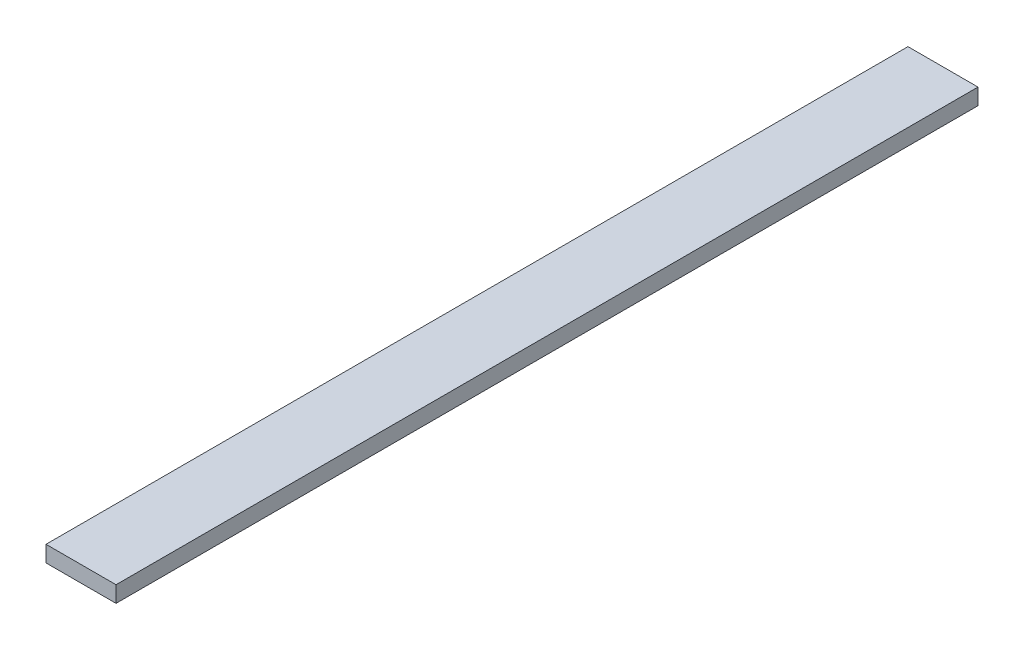
ISO-10303-21;
HEADER;
FILE_DESCRIPTION(('STEP AP214'),'2;1');
FILE_NAME('part.step','',(''),(''),'','','');
FILE_SCHEMA(('AUTOMOTIVE_DESIGN { 1 0 10303 214 1 1 1 1 }'));
ENDSEC;
DATA;
#1=APPLICATION_CONTEXT('core data for automotive mechanical design processes');
#2=APPLICATION_PROTOCOL_DEFINITION('international standard','automotive_design',2000,#1);
#3=PRODUCT_CONTEXT('',#1,'mechanical');
#4=PRODUCT('Part','Part','',(#3));
#5=PRODUCT_RELATED_PRODUCT_CATEGORY('part','',(#4));
#6=PRODUCT_DEFINITION_FORMATION('','',#4);
#7=PRODUCT_DEFINITION_CONTEXT('part definition',#1,'design');
#8=PRODUCT_DEFINITION('design','',#6,#7);
#9=PRODUCT_DEFINITION_SHAPE('','',#8);
#10=(LENGTH_UNIT() NAMED_UNIT(*) SI_UNIT(.MILLI.,.METRE.));
#11=(NAMED_UNIT(*) PLANE_ANGLE_UNIT() SI_UNIT($,.RADIAN.));
#12=(NAMED_UNIT(*) SI_UNIT($,.STERADIAN.) SOLID_ANGLE_UNIT());
#13=UNCERTAINTY_MEASURE_WITH_UNIT(LENGTH_MEASURE(1.E-05),#10,'distance_accuracy_value','');
#14=(GEOMETRIC_REPRESENTATION_CONTEXT(3) GLOBAL_UNCERTAINTY_ASSIGNED_CONTEXT((#13)) GLOBAL_UNIT_ASSIGNED_CONTEXT((#10,
#11,#12)) REPRESENTATION_CONTEXT('',''));
#15=CARTESIAN_POINT('',(0.,0.,0.));
#16=DIRECTION('',(0.,0.,1.));
#17=DIRECTION('',(1.,0.,0.));
#18=AXIS2_PLACEMENT_3D('',#15,#16,#17);
#19=CARTESIAN_POINT('',(0.,0.,508.));
#20=DIRECTION('',(1.,0.,0.));
#21=DIRECTION('',(0.,0.,-1.));
#22=AXIS2_PLACEMENT_3D('',#19,#20,#21);
#23=PLANE('',#22);
#24=DIRECTION('',(0.,-1.,0.));
#25=VECTOR('',#24,1.);
#26=CARTESIAN_POINT('',(0.,0.,0.));
#27=LINE('',#26,#25);
#28=CARTESIAN_POINT('',(0.,9.525,0.));
#29=VERTEX_POINT('',#28);
#30=CARTESIAN_POINT('',(0.,0.,0.));
#31=VERTEX_POINT('',#30);
#32=EDGE_CURVE('E96',#29,#31,#27,.T.);
#33=ORIENTED_EDGE('',*,*,#32,.T.);
#34=DIRECTION('',(0.,0.,-1.));
#35=VECTOR('',#34,1.);
#36=CARTESIAN_POINT('',(0.,0.,508.));
#37=LINE('',#36,#35);
#38=CARTESIAN_POINT('',(0.,0.,508.));
#39=VERTEX_POINT('',#38);
#40=EDGE_CURVE('E11',#39,#31,#37,.T.);
#41=ORIENTED_EDGE('',*,*,#40,.F.);
#42=DIRECTION('',(0.,-1.,0.));
#43=VECTOR('',#42,1.);
#44=CARTESIAN_POINT('',(0.,0.,508.));
#45=LINE('',#44,#43);
#46=CARTESIAN_POINT('',(0.,9.525,508.));
#47=VERTEX_POINT('',#46);
#48=EDGE_CURVE('E84',#47,#39,#45,.T.);
#49=ORIENTED_EDGE('',*,*,#48,.F.);
#50=DIRECTION('',(0.,0.,-1.));
#51=VECTOR('',#50,1.);
#52=CARTESIAN_POINT('',(0.,9.525,508.));
#53=LINE('',#52,#51);
#54=EDGE_CURVE('E92',#47,#29,#53,.T.);
#55=ORIENTED_EDGE('',*,*,#54,.T.);
#56=EDGE_LOOP('',(#33,#41,#49,#55));
#57=FACE_BOUND('',#56,.T.);
#58=ADVANCED_FACE('F33',(#57),#23,.F.);
#59=CARTESIAN_POINT('',(0.,0.,508.));
#60=DIRECTION('',(0.,1.,0.));
#61=DIRECTION('',(0.,0.,1.));
#62=AXIS2_PLACEMENT_3D('',#59,#60,#61);
#63=PLANE('',#62);
#64=DIRECTION('',(1.,0.,0.));
#65=VECTOR('',#64,1.);
#66=CARTESIAN_POINT('',(0.,0.,0.));
#67=LINE('',#66,#65);
#68=CARTESIAN_POINT('',(41.275,0.,0.));
#69=VERTEX_POINT('',#68);
#70=EDGE_CURVE('E88',#31,#69,#67,.T.);
#71=ORIENTED_EDGE('',*,*,#70,.T.);
#72=DIRECTION('',(0.,0.,-1.));
#73=VECTOR('',#72,1.);
#74=CARTESIAN_POINT('',(41.275,0.,508.));
#75=LINE('',#74,#73);
#76=CARTESIAN_POINT('',(41.275,0.,508.));
#77=VERTEX_POINT('',#76);
#78=EDGE_CURVE('E41',#77,#69,#75,.T.);
#79=ORIENTED_EDGE('',*,*,#78,.F.);
#80=DIRECTION('',(1.,0.,0.));
#81=VECTOR('',#80,1.);
#82=CARTESIAN_POINT('',(0.,0.,508.));
#83=LINE('',#82,#81);
#84=EDGE_CURVE('E79',#39,#77,#83,.T.);
#85=ORIENTED_EDGE('',*,*,#84,.F.);
#86=ORIENTED_EDGE('',*,*,#40,.T.);
#87=EDGE_LOOP('',(#71,#79,#85,#86));
#88=FACE_BOUND('',#87,.T.);
#89=ADVANCED_FACE('F87',(#88),#63,.F.);
#90=CARTESIAN_POINT('',(41.275,0.,508.));
#91=DIRECTION('',(-1.,0.,0.));
#92=DIRECTION('',(0.,0.,1.));
#93=AXIS2_PLACEMENT_3D('',#90,#91,#92);
#94=PLANE('',#93);
#95=DIRECTION('',(0.,1.,0.));
#96=VECTOR('',#95,1.);
#97=CARTESIAN_POINT('',(41.275,0.,0.));
#98=LINE('',#97,#96);
#99=CARTESIAN_POINT('',(41.275,9.525,0.));
#100=VERTEX_POINT('',#99);
#101=EDGE_CURVE('E66',#69,#100,#98,.T.);
#102=ORIENTED_EDGE('',*,*,#101,.T.);
#103=DIRECTION('',(0.,0.,-1.));
#104=VECTOR('',#103,1.);
#105=CARTESIAN_POINT('',(41.275,9.525,508.));
#106=LINE('',#105,#104);
#107=CARTESIAN_POINT('',(41.275,9.525,508.));
#108=VERTEX_POINT('',#107);
#109=EDGE_CURVE('E89',#108,#100,#106,.T.);
#110=ORIENTED_EDGE('',*,*,#109,.F.);
#111=DIRECTION('',(0.,1.,0.));
#112=VECTOR('',#111,1.);
#113=CARTESIAN_POINT('',(41.275,0.,508.));
#114=LINE('',#113,#112);
#115=EDGE_CURVE('E82',#77,#108,#114,.T.);
#116=ORIENTED_EDGE('',*,*,#115,.F.);
#117=ORIENTED_EDGE('',*,*,#78,.T.);
#118=EDGE_LOOP('',(#102,#110,#116,#117));
#119=FACE_BOUND('',#118,.T.);
#120=ADVANCED_FACE('F90',(#119),#94,.F.);
#121=CARTESIAN_POINT('',(0.,9.525,508.));
#122=DIRECTION('',(0.,-1.,0.));
#123=DIRECTION('',(0.,0.,-1.));
#124=AXIS2_PLACEMENT_3D('',#121,#122,#123);
#125=PLANE('',#124);
#126=DIRECTION('',(-1.,0.,0.));
#127=VECTOR('',#126,1.);
#128=CARTESIAN_POINT('',(0.,9.525,0.));
#129=LINE('',#128,#127);
#130=EDGE_CURVE('E72',#100,#29,#129,.T.);
#131=ORIENTED_EDGE('',*,*,#130,.T.);
#132=ORIENTED_EDGE('',*,*,#54,.F.);
#133=DIRECTION('',(-1.,0.,0.));
#134=VECTOR('',#133,1.);
#135=CARTESIAN_POINT('',(0.,9.525,508.));
#136=LINE('',#135,#134);
#137=EDGE_CURVE('E49',#108,#47,#136,.T.);
#138=ORIENTED_EDGE('',*,*,#137,.F.);
#139=ORIENTED_EDGE('',*,*,#109,.T.);
#140=EDGE_LOOP('',(#131,#132,#138,#139));
#141=FACE_BOUND('',#140,.T.);
#142=ADVANCED_FACE('F103',(#141),#125,.F.);
#143=CARTESIAN_POINT('',(0.,0.,508.));
#144=DIRECTION('',(0.,0.,-1.));
#145=DIRECTION('',(-1.,0.,0.));
#146=AXIS2_PLACEMENT_3D('',#143,#144,#145);
#147=PLANE('',#146);
#148=ORIENTED_EDGE('',*,*,#48,.T.);
#149=ORIENTED_EDGE('',*,*,#84,.T.);
#150=ORIENTED_EDGE('',*,*,#115,.T.);
#151=ORIENTED_EDGE('',*,*,#137,.T.);
#152=EDGE_LOOP('',(#148,#149,#150,#151));
#153=FACE_BOUND('',#152,.T.);
#154=ADVANCED_FACE('F80',(#153),#147,.F.);
#155=CARTESIAN_POINT('',(0.,0.,0.));
#156=DIRECTION('',(0.,0.,-1.));
#157=DIRECTION('',(-1.,0.,0.));
#158=AXIS2_PLACEMENT_3D('',#155,#156,#157);
#159=PLANE('',#158);
#160=ORIENTED_EDGE('',*,*,#32,.F.);
#161=ORIENTED_EDGE('',*,*,#130,.F.);
#162=ORIENTED_EDGE('',*,*,#101,.F.);
#163=ORIENTED_EDGE('',*,*,#70,.F.);
#164=EDGE_LOOP('',(#160,#161,#162,#163));
#165=FACE_BOUND('',#164,.T.);
#166=ADVANCED_FACE('F106',(#165),#159,.T.);
#167=CLOSED_SHELL('',(#58,#89,#120,#142,#154,#166));
#168=MANIFOLD_SOLID_BREP('B2',#167);
#169=ADVANCED_BREP_SHAPE_REPRESENTATION('',(#18,#168),#14);
#170=SHAPE_DEFINITION_REPRESENTATION(#9,#169);
ENDSEC;
END-ISO-10303-21;
